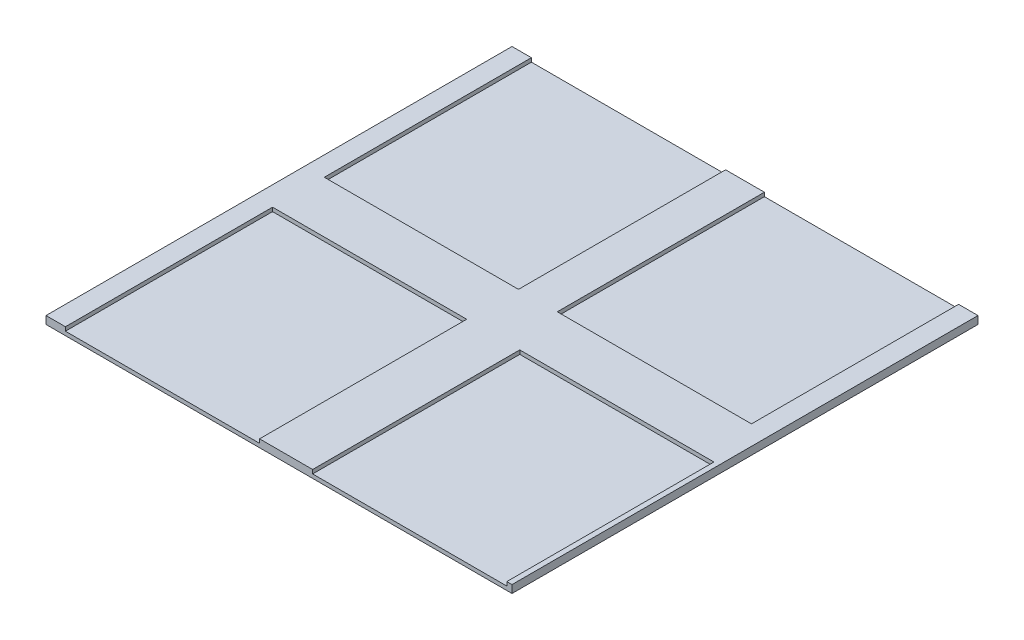
ISO-10303-21;
HEADER;
FILE_DESCRIPTION(('STEP AP214'),'2;1');
FILE_NAME('part.step','',(''),(''),'','','');
FILE_SCHEMA(('AUTOMOTIVE_DESIGN { 1 0 10303 214 1 1 1 1 }'));
ENDSEC;
DATA;
#1=APPLICATION_CONTEXT('core data for automotive mechanical design processes');
#2=APPLICATION_PROTOCOL_DEFINITION('international standard','automotive_design',2000,#1);
#3=PRODUCT_CONTEXT('',#1,'mechanical');
#4=PRODUCT('Part','Part','',(#3));
#5=PRODUCT_RELATED_PRODUCT_CATEGORY('part','',(#4));
#6=PRODUCT_DEFINITION_FORMATION('','',#4);
#7=PRODUCT_DEFINITION_CONTEXT('part definition',#1,'design');
#8=PRODUCT_DEFINITION('design','',#6,#7);
#9=PRODUCT_DEFINITION_SHAPE('','',#8);
#10=(LENGTH_UNIT() NAMED_UNIT(*) SI_UNIT(.MILLI.,.METRE.));
#11=(NAMED_UNIT(*) PLANE_ANGLE_UNIT() SI_UNIT($,.RADIAN.));
#12=(NAMED_UNIT(*) SI_UNIT($,.STERADIAN.) SOLID_ANGLE_UNIT());
#13=UNCERTAINTY_MEASURE_WITH_UNIT(LENGTH_MEASURE(1.E-05),#10,'distance_accuracy_value','');
#14=(GEOMETRIC_REPRESENTATION_CONTEXT(3) GLOBAL_UNCERTAINTY_ASSIGNED_CONTEXT((#13)) GLOBAL_UNIT_ASSIGNED_CONTEXT((#10,
#11,#12)) REPRESENTATION_CONTEXT('',''));
#15=CARTESIAN_POINT('',(0.,0.,0.));
#16=DIRECTION('',(0.,0.,1.));
#17=DIRECTION('',(1.,0.,0.));
#18=AXIS2_PLACEMENT_3D('',#15,#16,#17);
#19=CARTESIAN_POINT('',(160.,3.,20.));
#20=DIRECTION('',(0.,0.,-1.));
#21=DIRECTION('',(-1.,0.,0.));
#22=AXIS2_PLACEMENT_3D('',#19,#20,#21);
#23=PLANE('',#22);
#24=DIRECTION('',(0.,-1.,0.));
#25=VECTOR('',#24,1.);
#26=CARTESIAN_POINT('',(176.,166.04999218994,20.));
#27=LINE('',#26,#25);
#28=CARTESIAN_POINT('',(176.,6.00000000000001,20.));
#29=VERTEX_POINT('',#28);
#30=CARTESIAN_POINT('',(176.,3.,20.));
#31=VERTEX_POINT('',#30);
#32=EDGE_CURVE('E285',#29,#31,#27,.T.);
#33=ORIENTED_EDGE('',*,*,#32,.F.);
#34=DIRECTION('',(-1.,0.,0.));
#35=VECTOR('',#34,1.);
#36=CARTESIAN_POINT('',(160.,6.,20.));
#37=LINE('',#36,#35);
#38=CARTESIAN_POINT('',(26.,6.,20.));
#39=VERTEX_POINT('',#38);
#40=EDGE_CURVE('E198',#29,#39,#37,.T.);
#41=ORIENTED_EDGE('',*,*,#40,.T.);
#42=DIRECTION('',(0.,1.,0.));
#43=VECTOR('',#42,1.);
#44=CARTESIAN_POINT('',(26.,-220.436914860025,20.));
#45=LINE('',#44,#43);
#46=CARTESIAN_POINT('',(26.,3.,20.));
#47=VERTEX_POINT('',#46);
#48=EDGE_CURVE('E205',#47,#39,#45,.T.);
#49=ORIENTED_EDGE('',*,*,#48,.F.);
#50=DIRECTION('',(-1.,0.,0.));
#51=VECTOR('',#50,1.);
#52=CARTESIAN_POINT('',(160.,3.,20.));
#53=LINE('',#52,#51);
#54=EDGE_CURVE('E190',#31,#47,#53,.T.);
#55=ORIENTED_EDGE('',*,*,#54,.F.);
#56=EDGE_LOOP('',(#33,#41,#49,#55));
#57=FACE_BOUND('',#56,.T.);
#58=ADVANCED_FACE('F42',(#57),#23,.F.);
#59=CARTESIAN_POINT('',(0.,3.,0.));
#60=DIRECTION('',(0.,-1.,0.));
#61=DIRECTION('',(0.,0.,-1.));
#62=AXIS2_PLACEMENT_3D('',#59,#60,#61);
#63=PLANE('',#62);
#64=DIRECTION('',(0.,0.,1.));
#65=VECTOR('',#64,1.);
#66=CARTESIAN_POINT('',(176.,3.,20.));
#67=LINE('',#66,#65);
#68=CARTESIAN_POINT('',(176.,3.,180.));
#69=VERTEX_POINT('',#68);
#70=EDGE_CURVE('E58',#31,#69,#67,.T.);
#71=ORIENTED_EDGE('',*,*,#70,.F.);
#72=ORIENTED_EDGE('',*,*,#54,.T.);
#73=DIRECTION('',(0.,0.,1.));
#74=VECTOR('',#73,1.);
#75=CARTESIAN_POINT('',(26.,3.,20.));
#76=LINE('',#75,#74);
#77=CARTESIAN_POINT('',(26.,3.,180.));
#78=VERTEX_POINT('',#77);
#79=EDGE_CURVE('E194',#47,#78,#76,.T.);
#80=ORIENTED_EDGE('',*,*,#79,.T.);
#81=DIRECTION('',(-1.,0.,0.));
#82=VECTOR('',#81,1.);
#83=CARTESIAN_POINT('',(-180.,3.,180.));
#84=LINE('',#83,#82);
#85=EDGE_CURVE('E302',#69,#78,#84,.T.);
#86=ORIENTED_EDGE('',*,*,#85,.F.);
#87=EDGE_LOOP('',(#71,#72,#80,#86));
#88=FACE_BOUND('',#87,.T.);
#89=ADVANCED_FACE('F192',(#88),#63,.F.);
#90=CARTESIAN_POINT('',(-180.,6.,-180.));
#91=DIRECTION('',(0.,0.,1.));
#92=DIRECTION('',(1.,0.,0.));
#93=AXIS2_PLACEMENT_3D('',#90,#91,#92);
#94=PLANE('',#93);
#95=DIRECTION('',(1.,0.,0.));
#96=VECTOR('',#95,1.);
#97=CARTESIAN_POINT('',(-180.,3.,-180.));
#98=LINE('',#97,#96);
#99=CARTESIAN_POINT('',(-165.,3.,-180.));
#100=VERTEX_POINT('',#99);
#101=CARTESIAN_POINT('',(-15.,3.,-180.));
#102=VERTEX_POINT('',#101);
#103=EDGE_CURVE('E297',#100,#102,#98,.T.);
#104=ORIENTED_EDGE('',*,*,#103,.T.);
#105=DIRECTION('',(0.,1.,0.));
#106=VECTOR('',#105,1.);
#107=CARTESIAN_POINT('',(-15.,6.,-180.));
#108=LINE('',#107,#106);
#109=CARTESIAN_POINT('',(-15.,6.,-180.));
#110=VERTEX_POINT('',#109);
#111=EDGE_CURVE('E276',#102,#110,#108,.T.);
#112=ORIENTED_EDGE('',*,*,#111,.T.);
#113=DIRECTION('',(-1.,0.,0.));
#114=VECTOR('',#113,1.);
#115=CARTESIAN_POINT('',(-180.,6.,-180.));
#116=LINE('',#115,#114);
#117=CARTESIAN_POINT('',(15.,6.,-180.));
#118=VERTEX_POINT('',#117);
#119=EDGE_CURVE('E324',#118,#110,#116,.T.);
#120=ORIENTED_EDGE('',*,*,#119,.F.);
#121=DIRECTION('',(0.,-1.,0.));
#122=VECTOR('',#121,1.);
#123=CARTESIAN_POINT('',(15.,6.,-180.));
#124=LINE('',#123,#122);
#125=CARTESIAN_POINT('',(15.,3.,-180.));
#126=VERTEX_POINT('',#125);
#127=EDGE_CURVE('E233',#118,#126,#124,.T.);
#128=ORIENTED_EDGE('',*,*,#127,.T.);
#129=DIRECTION('',(1.,0.,0.));
#130=VECTOR('',#129,1.);
#131=CARTESIAN_POINT('',(-180.,3.,-180.));
#132=LINE('',#131,#130);
#133=CARTESIAN_POINT('',(165.,3.,-180.));
#134=VERTEX_POINT('',#133);
#135=EDGE_CURVE('E300',#126,#134,#132,.T.);
#136=ORIENTED_EDGE('',*,*,#135,.T.);
#137=DIRECTION('',(0.,1.,0.));
#138=VECTOR('',#137,1.);
#139=CARTESIAN_POINT('',(165.,6.,-180.));
#140=LINE('',#139,#138);
#141=CARTESIAN_POINT('',(165.,6.,-180.));
#142=VERTEX_POINT('',#141);
#143=EDGE_CURVE('E270',#134,#142,#140,.T.);
#144=ORIENTED_EDGE('',*,*,#143,.T.);
#145=CARTESIAN_POINT('',(180.,6.,-180.));
#146=VERTEX_POINT('',#145);
#147=EDGE_CURVE('E322',#146,#142,#116,.T.);
#148=ORIENTED_EDGE('',*,*,#147,.F.);
#149=DIRECTION('',(0.,-1.,0.));
#150=VECTOR('',#149,1.);
#151=CARTESIAN_POINT('',(180.,6.,-180.));
#152=LINE('',#151,#150);
#153=CARTESIAN_POINT('',(180.,0.,-180.));
#154=VERTEX_POINT('',#153);
#155=EDGE_CURVE('E46',#146,#154,#152,.T.);
#156=ORIENTED_EDGE('',*,*,#155,.T.);
#157=DIRECTION('',(-1.,0.,0.));
#158=VECTOR('',#157,1.);
#159=CARTESIAN_POINT('',(-180.,0.,-180.));
#160=LINE('',#159,#158);
#161=CARTESIAN_POINT('',(-180.,0.,-180.));
#162=VERTEX_POINT('',#161);
#163=EDGE_CURVE('E330',#154,#162,#160,.T.);
#164=ORIENTED_EDGE('',*,*,#163,.T.);
#165=DIRECTION('',(0.,-1.,0.));
#166=VECTOR('',#165,1.);
#167=CARTESIAN_POINT('',(-180.,6.,-180.));
#168=LINE('',#167,#166);
#169=CARTESIAN_POINT('',(-180.,6.,-180.));
#170=VERTEX_POINT('',#169);
#171=EDGE_CURVE('E338',#170,#162,#168,.T.);
#172=ORIENTED_EDGE('',*,*,#171,.F.);
#173=CARTESIAN_POINT('',(-165.,6.,-180.));
#174=VERTEX_POINT('',#173);
#175=EDGE_CURVE('E320',#174,#170,#116,.T.);
#176=ORIENTED_EDGE('',*,*,#175,.F.);
#177=DIRECTION('',(0.,-1.,0.));
#178=VECTOR('',#177,1.);
#179=CARTESIAN_POINT('',(-165.,6.,-180.));
#180=LINE('',#179,#178);
#181=EDGE_CURVE('E273',#174,#100,#180,.T.);
#182=ORIENTED_EDGE('',*,*,#181,.T.);
#183=EDGE_LOOP('',(#104,#112,#120,#128,#136,#144,#148,#156,#164,#172,#176,#182));
#184=FACE_BOUND('',#183,.T.);
#185=ADVANCED_FACE('F346',(#184),#94,.F.);
#186=CARTESIAN_POINT('',(-180.,6.,180.));
#187=DIRECTION('',(0.,0.,-1.));
#188=DIRECTION('',(-1.,0.,0.));
#189=AXIS2_PLACEMENT_3D('',#186,#187,#188);
#190=PLANE('',#189);
#191=ORIENTED_EDGE('',*,*,#85,.T.);
#192=DIRECTION('',(0.,1.,0.));
#193=VECTOR('',#192,1.);
#194=CARTESIAN_POINT('',(26.,6.,180.));
#195=LINE('',#194,#193);
#196=CARTESIAN_POINT('',(26.,6.,180.));
#197=VERTEX_POINT('',#196);
#198=EDGE_CURVE('E208',#78,#197,#195,.T.);
#199=ORIENTED_EDGE('',*,*,#198,.T.);
#200=DIRECTION('',(1.,0.,0.));
#201=VECTOR('',#200,1.);
#202=CARTESIAN_POINT('',(-180.,6.,180.));
#203=LINE('',#202,#201);
#204=CARTESIAN_POINT('',(-15.,6.,180.));
#205=VERTEX_POINT('',#204);
#206=EDGE_CURVE('E326',#205,#197,#203,.T.);
#207=ORIENTED_EDGE('',*,*,#206,.F.);
#208=DIRECTION('',(0.,-1.,0.));
#209=VECTOR('',#208,1.);
#210=CARTESIAN_POINT('',(-15.,6.,180.));
#211=LINE('',#210,#209);
#212=CARTESIAN_POINT('',(-15.,3.,180.));
#213=VERTEX_POINT('',#212);
#214=EDGE_CURVE('E279',#205,#213,#211,.T.);
#215=ORIENTED_EDGE('',*,*,#214,.T.);
#216=DIRECTION('',(-1.,0.,0.));
#217=VECTOR('',#216,1.);
#218=CARTESIAN_POINT('',(-180.,3.,180.));
#219=LINE('',#218,#217);
#220=CARTESIAN_POINT('',(-165.,3.,180.));
#221=VERTEX_POINT('',#220);
#222=EDGE_CURVE('E304',#213,#221,#219,.T.);
#223=ORIENTED_EDGE('',*,*,#222,.T.);
#224=DIRECTION('',(0.,1.,0.));
#225=VECTOR('',#224,1.);
#226=CARTESIAN_POINT('',(-165.,6.,180.));
#227=LINE('',#226,#225);
#228=CARTESIAN_POINT('',(-165.,6.,180.));
#229=VERTEX_POINT('',#228);
#230=EDGE_CURVE('E282',#221,#229,#227,.T.);
#231=ORIENTED_EDGE('',*,*,#230,.T.);
#232=CARTESIAN_POINT('',(-180.,6.,180.));
#233=VERTEX_POINT('',#232);
#234=EDGE_CURVE('E327',#233,#229,#203,.T.);
#235=ORIENTED_EDGE('',*,*,#234,.F.);
#236=DIRECTION('',(0.,-1.,0.));
#237=VECTOR('',#236,1.);
#238=CARTESIAN_POINT('',(-180.,6.,180.));
#239=LINE('',#238,#237);
#240=CARTESIAN_POINT('',(-180.,0.,180.));
#241=VERTEX_POINT('',#240);
#242=EDGE_CURVE('E336',#233,#241,#239,.T.);
#243=ORIENTED_EDGE('',*,*,#242,.T.);
#244=DIRECTION('',(1.,0.,0.));
#245=VECTOR('',#244,1.);
#246=CARTESIAN_POINT('',(-180.,0.,180.));
#247=LINE('',#246,#245);
#248=CARTESIAN_POINT('',(180.,0.,180.));
#249=VERTEX_POINT('',#248);
#250=EDGE_CURVE('E321',#241,#249,#247,.T.);
#251=ORIENTED_EDGE('',*,*,#250,.T.);
#252=DIRECTION('',(0.,-1.,0.));
#253=VECTOR('',#252,1.);
#254=CARTESIAN_POINT('',(180.,6.,180.));
#255=LINE('',#254,#253);
#256=CARTESIAN_POINT('',(180.,6.00000000000001,180.));
#257=VERTEX_POINT('',#256);
#258=EDGE_CURVE('E88',#257,#249,#255,.T.);
#259=ORIENTED_EDGE('',*,*,#258,.F.);
#260=DIRECTION('',(1.,0.,0.));
#261=VECTOR('',#260,1.);
#262=CARTESIAN_POINT('',(180.,6.00000000000001,180.));
#263=LINE('',#262,#261);
#264=CARTESIAN_POINT('',(176.,6.00000000000001,180.));
#265=VERTEX_POINT('',#264);
#266=EDGE_CURVE('E292',#265,#257,#263,.T.);
#267=ORIENTED_EDGE('',*,*,#266,.F.);
#268=DIRECTION('',(0.,-1.,0.));
#269=VECTOR('',#268,1.);
#270=CARTESIAN_POINT('',(176.,166.04999218994,180.));
#271=LINE('',#270,#269);
#272=EDGE_CURVE('E287',#265,#69,#271,.T.);
#273=ORIENTED_EDGE('',*,*,#272,.T.);
#274=EDGE_LOOP('',(#191,#199,#207,#215,#223,#231,#235,#243,#251,#259,#267,#273));
#275=FACE_BOUND('',#274,.T.);
#276=ADVANCED_FACE('F354',(#275),#190,.F.);
#277=CARTESIAN_POINT('',(0.,6.,0.));
#278=DIRECTION('',(0.,1.,0.));
#279=DIRECTION('',(0.,0.,1.));
#280=AXIS2_PLACEMENT_3D('',#277,#278,#279);
#281=PLANE('',#280);
#282=DIRECTION('',(0.,0.,1.));
#283=VECTOR('',#282,1.);
#284=CARTESIAN_POINT('',(26.,6.,20.));
#285=LINE('',#284,#283);
#286=EDGE_CURVE('E211',#39,#197,#285,.T.);
#287=ORIENTED_EDGE('',*,*,#286,.F.);
#288=ORIENTED_EDGE('',*,*,#40,.F.);
#289=DIRECTION('',(0.,0.,1.));
#290=VECTOR('',#289,1.);
#291=CARTESIAN_POINT('',(176.,6.00000000000001,20.));
#292=LINE('',#291,#290);
#293=EDGE_CURVE('E288',#29,#265,#292,.T.);
#294=ORIENTED_EDGE('',*,*,#293,.T.);
#295=ORIENTED_EDGE('',*,*,#266,.T.);
#296=DIRECTION('',(0.,0.,-1.));
#297=VECTOR('',#296,1.);
#298=CARTESIAN_POINT('',(180.,6.,-180.));
#299=LINE('',#298,#297);
#300=EDGE_CURVE('E93',#257,#146,#299,.T.);
#301=ORIENTED_EDGE('',*,*,#300,.T.);
#302=ORIENTED_EDGE('',*,*,#147,.T.);
#303=DIRECTION('',(0.,0.,-1.));
#304=VECTOR('',#303,1.);
#305=CARTESIAN_POINT('',(165.,6.,-170.));
#306=LINE('',#305,#304);
#307=CARTESIAN_POINT('',(165.,6.,-20.));
#308=VERTEX_POINT('',#307);
#309=EDGE_CURVE('E259',#308,#142,#306,.T.);
#310=ORIENTED_EDGE('',*,*,#309,.F.);
#311=DIRECTION('',(1.,0.,0.));
#312=VECTOR('',#311,1.);
#313=CARTESIAN_POINT('',(160.,6.,-20.));
#314=LINE('',#313,#312);
#315=CARTESIAN_POINT('',(15.,6.,-20.));
#316=VERTEX_POINT('',#315);
#317=EDGE_CURVE('E199',#316,#308,#314,.T.);
#318=ORIENTED_EDGE('',*,*,#317,.F.);
#319=DIRECTION('',(0.,0.,1.));
#320=VECTOR('',#319,1.);
#321=CARTESIAN_POINT('',(15.,6.,-170.));
#322=LINE('',#321,#320);
#323=EDGE_CURVE('E243',#118,#316,#322,.T.);
#324=ORIENTED_EDGE('',*,*,#323,.F.);
#325=ORIENTED_EDGE('',*,*,#119,.T.);
#326=DIRECTION('',(0.,0.,-1.));
#327=VECTOR('',#326,1.);
#328=CARTESIAN_POINT('',(-15.,6.,-170.));
#329=LINE('',#328,#327);
#330=CARTESIAN_POINT('',(-15.,6.,-20.));
#331=VERTEX_POINT('',#330);
#332=EDGE_CURVE('E223',#331,#110,#329,.T.);
#333=ORIENTED_EDGE('',*,*,#332,.F.);
#334=DIRECTION('',(1.,0.,0.));
#335=VECTOR('',#334,1.);
#336=CARTESIAN_POINT('',(-160.,6.,-20.));
#337=LINE('',#336,#335);
#338=CARTESIAN_POINT('',(-165.,6.,-20.));
#339=VERTEX_POINT('',#338);
#340=EDGE_CURVE('E312',#339,#331,#337,.T.);
#341=ORIENTED_EDGE('',*,*,#340,.F.);
#342=DIRECTION('',(0.,0.,1.));
#343=VECTOR('',#342,1.);
#344=CARTESIAN_POINT('',(-165.,6.,-170.));
#345=LINE('',#344,#343);
#346=EDGE_CURVE('E249',#174,#339,#345,.T.);
#347=ORIENTED_EDGE('',*,*,#346,.F.);
#348=ORIENTED_EDGE('',*,*,#175,.T.);
#349=DIRECTION('',(0.,0.,1.));
#350=VECTOR('',#349,1.);
#351=CARTESIAN_POINT('',(-180.,6.,-180.));
#352=LINE('',#351,#350);
#353=EDGE_CURVE('E67',#170,#233,#352,.T.);
#354=ORIENTED_EDGE('',*,*,#353,.T.);
#355=ORIENTED_EDGE('',*,*,#234,.T.);
#356=DIRECTION('',(0.,0.,1.));
#357=VECTOR('',#356,1.);
#358=CARTESIAN_POINT('',(-165.,6.,170.));
#359=LINE('',#358,#357);
#360=CARTESIAN_POINT('',(-165.,6.,20.));
#361=VERTEX_POINT('',#360);
#362=EDGE_CURVE('E221',#361,#229,#359,.T.);
#363=ORIENTED_EDGE('',*,*,#362,.F.);
#364=DIRECTION('',(-1.,0.,0.));
#365=VECTOR('',#364,1.);
#366=CARTESIAN_POINT('',(-160.,6.,20.));
#367=LINE('',#366,#365);
#368=CARTESIAN_POINT('',(-15.,6.,20.));
#369=VERTEX_POINT('',#368);
#370=EDGE_CURVE('E307',#369,#361,#367,.T.);
#371=ORIENTED_EDGE('',*,*,#370,.F.);
#372=DIRECTION('',(0.,0.,-1.));
#373=VECTOR('',#372,1.);
#374=CARTESIAN_POINT('',(-15.,6.,170.));
#375=LINE('',#374,#373);
#376=EDGE_CURVE('E217',#205,#369,#375,.T.);
#377=ORIENTED_EDGE('',*,*,#376,.F.);
#378=ORIENTED_EDGE('',*,*,#206,.T.);
#379=EDGE_LOOP('',(#287,#288,#294,#295,#301,#302,#310,#318,#324,#325,#333,#341,#347,#348,#354,
#355,#363,#371,#377,#378));
#380=FACE_BOUND('',#379,.T.);
#381=ADVANCED_FACE('F357',(#380),#281,.T.);
#382=CARTESIAN_POINT('',(180.,6.,-180.));
#383=DIRECTION('',(-1.,0.,0.));
#384=DIRECTION('',(0.,0.,1.));
#385=AXIS2_PLACEMENT_3D('',#382,#383,#384);
#386=PLANE('',#385);
#387=ORIENTED_EDGE('',*,*,#300,.F.);
#388=ORIENTED_EDGE('',*,*,#258,.T.);
#389=DIRECTION('',(0.,0.,-1.));
#390=VECTOR('',#389,1.);
#391=CARTESIAN_POINT('',(180.,0.,-180.));
#392=LINE('',#391,#390);
#393=EDGE_CURVE('E317',#249,#154,#392,.T.);
#394=ORIENTED_EDGE('',*,*,#393,.T.);
#395=ORIENTED_EDGE('',*,*,#155,.F.);
#396=EDGE_LOOP('',(#387,#388,#394,#395));
#397=FACE_BOUND('',#396,.T.);
#398=ADVANCED_FACE('F44',(#397),#386,.F.);
#399=CARTESIAN_POINT('',(-180.,6.,-180.));
#400=DIRECTION('',(1.,0.,0.));
#401=DIRECTION('',(0.,0.,-1.));
#402=AXIS2_PLACEMENT_3D('',#399,#400,#401);
#403=PLANE('',#402);
#404=DIRECTION('',(0.,0.,1.));
#405=VECTOR('',#404,1.);
#406=CARTESIAN_POINT('',(-180.,0.,-180.));
#407=LINE('',#406,#405);
#408=EDGE_CURVE('E332',#162,#241,#407,.T.);
#409=ORIENTED_EDGE('',*,*,#408,.T.);
#410=ORIENTED_EDGE('',*,*,#242,.F.);
#411=ORIENTED_EDGE('',*,*,#353,.F.);
#412=ORIENTED_EDGE('',*,*,#171,.T.);
#413=EDGE_LOOP('',(#409,#410,#411,#412));
#414=FACE_BOUND('',#413,.T.);
#415=ADVANCED_FACE('F351',(#414),#403,.F.);
#416=CARTESIAN_POINT('',(0.,0.,0.));
#417=DIRECTION('',(0.,1.,0.));
#418=DIRECTION('',(0.,0.,1.));
#419=AXIS2_PLACEMENT_3D('',#416,#417,#418);
#420=PLANE('',#419);
#421=CARTESIAN_POINT('',(0.,0.,0.));
#422=DIRECTION('',(0.,-1.,0.));
#423=DIRECTION('',(0.,0.,-1.));
#424=AXIS2_PLACEMENT_3D('',#421,#422,#423);
#425=CIRCLE('',#424,42.212172728135);
#426=CARTESIAN_POINT('',(0.,0.,-42.212172728135));
#427=VERTEX_POINT('',#426);
#428=EDGE_CURVE('E11',#427,#427,#425,.T.);
#429=ORIENTED_EDGE('',*,*,#428,.F.);
#430=EDGE_LOOP('',(#429));
#431=FACE_BOUND('',#430,.T.);
#432=ORIENTED_EDGE('',*,*,#393,.F.);
#433=ORIENTED_EDGE('',*,*,#250,.F.);
#434=ORIENTED_EDGE('',*,*,#408,.F.);
#435=ORIENTED_EDGE('',*,*,#163,.F.);
#436=EDGE_LOOP('',(#432,#433,#434,#435));
#437=FACE_BOUND('',#436,.T.);
#438=ADVANCED_FACE('F350',(#431,#437),#420,.F.);
#439=CARTESIAN_POINT('',(-160.,3.,20.));
#440=DIRECTION('',(0.,0.,-1.));
#441=DIRECTION('',(-1.,0.,0.));
#442=AXIS2_PLACEMENT_3D('',#439,#440,#441);
#443=PLANE('',#442);
#444=ORIENTED_EDGE('',*,*,#370,.T.);
#445=DIRECTION('',(0.,1.,0.));
#446=VECTOR('',#445,1.);
#447=CARTESIAN_POINT('',(-165.,-236.104457123936,20.));
#448=LINE('',#447,#446);
#449=CARTESIAN_POINT('',(-165.,3.,20.));
#450=VERTEX_POINT('',#449);
#451=EDGE_CURVE('E230',#450,#361,#448,.T.);
#452=ORIENTED_EDGE('',*,*,#451,.F.);
#453=DIRECTION('',(-1.,0.,0.));
#454=VECTOR('',#453,1.);
#455=CARTESIAN_POINT('',(-160.,3.,20.));
#456=LINE('',#455,#454);
#457=CARTESIAN_POINT('',(-15.,3.,20.));
#458=VERTEX_POINT('',#457);
#459=EDGE_CURVE('E315',#458,#450,#456,.T.);
#460=ORIENTED_EDGE('',*,*,#459,.F.);
#461=DIRECTION('',(0.,1.,0.));
#462=VECTOR('',#461,1.);
#463=CARTESIAN_POINT('',(-15.,-236.104457123936,20.));
#464=LINE('',#463,#462);
#465=EDGE_CURVE('E229',#458,#369,#464,.T.);
#466=ORIENTED_EDGE('',*,*,#465,.T.);
#467=EDGE_LOOP('',(#444,#452,#460,#466));
#468=FACE_BOUND('',#467,.T.);
#469=ADVANCED_FACE('F364',(#468),#443,.F.);
#470=CARTESIAN_POINT('',(0.,3.,0.));
#471=DIRECTION('',(0.,1.,0.));
#472=DIRECTION('',(0.,0.,1.));
#473=AXIS2_PLACEMENT_3D('',#470,#471,#472);
#474=PLANE('',#473);
#475=ORIENTED_EDGE('',*,*,#222,.F.);
#476=DIRECTION('',(0.,0.,-1.));
#477=VECTOR('',#476,1.);
#478=CARTESIAN_POINT('',(-15.,3.,170.));
#479=LINE('',#478,#477);
#480=EDGE_CURVE('E226',#213,#458,#479,.T.);
#481=ORIENTED_EDGE('',*,*,#480,.T.);
#482=ORIENTED_EDGE('',*,*,#459,.T.);
#483=DIRECTION('',(0.,0.,1.));
#484=VECTOR('',#483,1.);
#485=CARTESIAN_POINT('',(-165.,3.,170.));
#486=LINE('',#485,#484);
#487=EDGE_CURVE('E220',#450,#221,#486,.T.);
#488=ORIENTED_EDGE('',*,*,#487,.T.);
#489=EDGE_LOOP('',(#475,#481,#482,#488));
#490=FACE_BOUND('',#489,.T.);
#491=ADVANCED_FACE('F400',(#490),#474,.T.);
#492=CARTESIAN_POINT('',(160.,3.,-20.));
#493=DIRECTION('',(0.,0.,1.));
#494=DIRECTION('',(1.,0.,0.));
#495=AXIS2_PLACEMENT_3D('',#492,#493,#494);
#496=PLANE('',#495);
#497=ORIENTED_EDGE('',*,*,#317,.T.);
#498=DIRECTION('',(0.,1.,0.));
#499=VECTOR('',#498,1.);
#500=CARTESIAN_POINT('',(165.,-236.104457123936,-20.));
#501=LINE('',#500,#499);
#502=CARTESIAN_POINT('',(165.,2.99999999999995,-20.));
#503=VERTEX_POINT('',#502);
#504=EDGE_CURVE('E256',#503,#308,#501,.T.);
#505=ORIENTED_EDGE('',*,*,#504,.F.);
#506=DIRECTION('',(1.,0.,0.));
#507=VECTOR('',#506,1.);
#508=CARTESIAN_POINT('',(160.,3.,-20.));
#509=LINE('',#508,#507);
#510=CARTESIAN_POINT('',(15.,3.,-20.));
#511=VERTEX_POINT('',#510);
#512=EDGE_CURVE('E310',#511,#503,#509,.T.);
#513=ORIENTED_EDGE('',*,*,#512,.F.);
#514=DIRECTION('',(0.,1.,0.));
#515=VECTOR('',#514,1.);
#516=CARTESIAN_POINT('',(15.,-236.104457123936,-20.));
#517=LINE('',#516,#515);
#518=EDGE_CURVE('E216',#511,#316,#517,.T.);
#519=ORIENTED_EDGE('',*,*,#518,.T.);
#520=EDGE_LOOP('',(#497,#505,#513,#519));
#521=FACE_BOUND('',#520,.T.);
#522=ADVANCED_FACE('F396',(#521),#496,.F.);
#523=CARTESIAN_POINT('',(0.,3.,0.));
#524=DIRECTION('',(0.,1.,0.));
#525=DIRECTION('',(0.,0.,1.));
#526=AXIS2_PLACEMENT_3D('',#523,#524,#525);
#527=PLANE('',#526);
#528=ORIENTED_EDGE('',*,*,#512,.T.);
#529=DIRECTION('',(0.,0.,-1.));
#530=VECTOR('',#529,1.);
#531=CARTESIAN_POINT('',(165.,3.,-170.));
#532=LINE('',#531,#530);
#533=EDGE_CURVE('E260',#503,#134,#532,.T.);
#534=ORIENTED_EDGE('',*,*,#533,.T.);
#535=ORIENTED_EDGE('',*,*,#135,.F.);
#536=DIRECTION('',(0.,0.,1.));
#537=VECTOR('',#536,1.);
#538=CARTESIAN_POINT('',(15.,3.,-170.));
#539=LINE('',#538,#537);
#540=EDGE_CURVE('E255',#126,#511,#539,.T.);
#541=ORIENTED_EDGE('',*,*,#540,.T.);
#542=EDGE_LOOP('',(#528,#534,#535,#541));
#543=FACE_BOUND('',#542,.T.);
#544=ADVANCED_FACE('F399',(#543),#527,.T.);
#545=CARTESIAN_POINT('',(-160.,3.,-20.));
#546=DIRECTION('',(0.,0.,1.));
#547=DIRECTION('',(1.,0.,0.));
#548=AXIS2_PLACEMENT_3D('',#545,#546,#547);
#549=PLANE('',#548);
#550=ORIENTED_EDGE('',*,*,#340,.T.);
#551=DIRECTION('',(0.,1.,0.));
#552=VECTOR('',#551,1.);
#553=CARTESIAN_POINT('',(-15.,-236.104457123936,-20.));
#554=LINE('',#553,#552);
#555=CARTESIAN_POINT('',(-15.,3.,-20.));
#556=VERTEX_POINT('',#555);
#557=EDGE_CURVE('E240',#556,#331,#554,.T.);
#558=ORIENTED_EDGE('',*,*,#557,.F.);
#559=DIRECTION('',(1.,0.,0.));
#560=VECTOR('',#559,1.);
#561=CARTESIAN_POINT('',(-160.,3.,-20.));
#562=LINE('',#561,#560);
#563=CARTESIAN_POINT('',(-165.,3.,-20.));
#564=VERTEX_POINT('',#563);
#565=EDGE_CURVE('E306',#564,#556,#562,.T.);
#566=ORIENTED_EDGE('',*,*,#565,.F.);
#567=DIRECTION('',(0.,1.,0.));
#568=VECTOR('',#567,1.);
#569=CARTESIAN_POINT('',(-165.,-236.104457123936,-20.));
#570=LINE('',#569,#568);
#571=EDGE_CURVE('E236',#564,#339,#570,.T.);
#572=ORIENTED_EDGE('',*,*,#571,.T.);
#573=EDGE_LOOP('',(#550,#558,#566,#572));
#574=FACE_BOUND('',#573,.T.);
#575=ADVANCED_FACE('F404',(#574),#549,.F.);
#576=CARTESIAN_POINT('',(0.,3.,0.));
#577=DIRECTION('',(0.,-1.,0.));
#578=DIRECTION('',(0.,0.,-1.));
#579=AXIS2_PLACEMENT_3D('',#576,#577,#578);
#580=PLANE('',#579);
#581=ORIENTED_EDGE('',*,*,#103,.F.);
#582=DIRECTION('',(0.,0.,1.));
#583=VECTOR('',#582,1.);
#584=CARTESIAN_POINT('',(-165.,3.,-170.));
#585=LINE('',#584,#583);
#586=EDGE_CURVE('E239',#100,#564,#585,.T.);
#587=ORIENTED_EDGE('',*,*,#586,.T.);
#588=ORIENTED_EDGE('',*,*,#565,.T.);
#589=DIRECTION('',(0.,0.,-1.));
#590=VECTOR('',#589,1.);
#591=CARTESIAN_POINT('',(-15.,3.,-170.));
#592=LINE('',#591,#590);
#593=EDGE_CURVE('E246',#556,#102,#592,.T.);
#594=ORIENTED_EDGE('',*,*,#593,.T.);
#595=EDGE_LOOP('',(#581,#587,#588,#594));
#596=FACE_BOUND('',#595,.T.);
#597=ADVANCED_FACE('F408',(#596),#580,.F.);
#598=CARTESIAN_POINT('',(0.,-1.,0.));
#599=DIRECTION('',(0.,1.,0.));
#600=DIRECTION('',(0.,0.,1.));
#601=AXIS2_PLACEMENT_3D('',#598,#599,#600);
#602=CYLINDRICAL_SURFACE('',#601,42.212172728135);
#603=CARTESIAN_POINT('',(0.,-1.,0.));
#604=DIRECTION('',(0.,-1.,0.));
#605=DIRECTION('',(0.,0.,-1.));
#606=AXIS2_PLACEMENT_3D('',#603,#604,#605);
#607=CIRCLE('',#606,42.212172728135);
#608=CARTESIAN_POINT('',(0.,-1.,-42.212172728135));
#609=VERTEX_POINT('',#608);
#610=EDGE_CURVE('E291',#609,#609,#607,.T.);
#611=ORIENTED_EDGE('',*,*,#610,.F.);
#612=EDGE_LOOP('',(#611));
#613=FACE_BOUND('',#612,.T.);
#614=ORIENTED_EDGE('',*,*,#428,.T.);
#615=EDGE_LOOP('',(#614));
#616=FACE_BOUND('',#615,.T.);
#617=ADVANCED_FACE('F384',(#613,#616),#602,.T.);
#618=CARTESIAN_POINT('',(0.,-1.,0.));
#619=DIRECTION('',(0.,-1.,0.));
#620=DIRECTION('',(0.,0.,-1.));
#621=AXIS2_PLACEMENT_3D('',#618,#619,#620);
#622=PLANE('',#621);
#623=ORIENTED_EDGE('',*,*,#610,.T.);
#624=EDGE_LOOP('',(#623));
#625=FACE_BOUND('',#624,.T.);
#626=ADVANCED_FACE('F375',(#625),#622,.T.);
#627=CARTESIAN_POINT('',(176.,166.04999218994,20.));
#628=DIRECTION('',(1.,0.,0.));
#629=DIRECTION('',(0.,0.,-1.));
#630=AXIS2_PLACEMENT_3D('',#627,#628,#629);
#631=PLANE('',#630);
#632=ORIENTED_EDGE('',*,*,#293,.F.);
#633=ORIENTED_EDGE('',*,*,#32,.T.);
#634=ORIENTED_EDGE('',*,*,#70,.T.);
#635=ORIENTED_EDGE('',*,*,#272,.F.);
#636=EDGE_LOOP('',(#632,#633,#634,#635));
#637=FACE_BOUND('',#636,.T.);
#638=ADVANCED_FACE('F372',(#637),#631,.F.);
#639=CARTESIAN_POINT('',(-15.,-236.104457123936,-170.));
#640=DIRECTION('',(1.,0.,0.));
#641=DIRECTION('',(0.,0.,-1.));
#642=AXIS2_PLACEMENT_3D('',#639,#640,#641);
#643=PLANE('',#642);
#644=ORIENTED_EDGE('',*,*,#593,.F.);
#645=ORIENTED_EDGE('',*,*,#557,.T.);
#646=ORIENTED_EDGE('',*,*,#332,.T.);
#647=ORIENTED_EDGE('',*,*,#111,.F.);
#648=EDGE_LOOP('',(#644,#645,#646,#647));
#649=FACE_BOUND('',#648,.T.);
#650=ADVANCED_FACE('F374',(#649),#643,.F.);
#651=CARTESIAN_POINT('',(-165.,-236.104457123936,-170.));
#652=DIRECTION('',(-1.,0.,0.));
#653=DIRECTION('',(0.,0.,1.));
#654=AXIS2_PLACEMENT_3D('',#651,#652,#653);
#655=PLANE('',#654);
#656=ORIENTED_EDGE('',*,*,#346,.T.);
#657=ORIENTED_EDGE('',*,*,#571,.F.);
#658=ORIENTED_EDGE('',*,*,#586,.F.);
#659=ORIENTED_EDGE('',*,*,#181,.F.);
#660=EDGE_LOOP('',(#656,#657,#658,#659));
#661=FACE_BOUND('',#660,.T.);
#662=ADVANCED_FACE('F381',(#661),#655,.F.);
#663=CARTESIAN_POINT('',(15.,-236.104457123936,-170.));
#664=DIRECTION('',(-1.,0.,0.));
#665=DIRECTION('',(0.,0.,1.));
#666=AXIS2_PLACEMENT_3D('',#663,#664,#665);
#667=PLANE('',#666);
#668=ORIENTED_EDGE('',*,*,#323,.T.);
#669=ORIENTED_EDGE('',*,*,#518,.F.);
#670=ORIENTED_EDGE('',*,*,#540,.F.);
#671=ORIENTED_EDGE('',*,*,#127,.F.);
#672=EDGE_LOOP('',(#668,#669,#670,#671));
#673=FACE_BOUND('',#672,.T.);
#674=ADVANCED_FACE('F572',(#673),#667,.F.);
#675=CARTESIAN_POINT('',(165.,-236.104457123936,-170.));
#676=DIRECTION('',(1.,0.,0.));
#677=DIRECTION('',(0.,0.,-1.));
#678=AXIS2_PLACEMENT_3D('',#675,#676,#677);
#679=PLANE('',#678);
#680=ORIENTED_EDGE('',*,*,#533,.F.);
#681=ORIENTED_EDGE('',*,*,#504,.T.);
#682=ORIENTED_EDGE('',*,*,#309,.T.);
#683=ORIENTED_EDGE('',*,*,#143,.F.);
#684=EDGE_LOOP('',(#680,#681,#682,#683));
#685=FACE_BOUND('',#684,.T.);
#686=ADVANCED_FACE('F582',(#685),#679,.F.);
#687=CARTESIAN_POINT('',(-165.,-236.104457123936,170.));
#688=DIRECTION('',(-1.,0.,0.));
#689=DIRECTION('',(0.,0.,1.));
#690=AXIS2_PLACEMENT_3D('',#687,#688,#689);
#691=PLANE('',#690);
#692=ORIENTED_EDGE('',*,*,#487,.F.);
#693=ORIENTED_EDGE('',*,*,#451,.T.);
#694=ORIENTED_EDGE('',*,*,#362,.T.);
#695=ORIENTED_EDGE('',*,*,#230,.F.);
#696=EDGE_LOOP('',(#692,#693,#694,#695));
#697=FACE_BOUND('',#696,.T.);
#698=ADVANCED_FACE('F361',(#697),#691,.F.);
#699=CARTESIAN_POINT('',(-15.,-236.104457123936,170.));
#700=DIRECTION('',(1.,0.,0.));
#701=DIRECTION('',(0.,0.,-1.));
#702=AXIS2_PLACEMENT_3D('',#699,#700,#701);
#703=PLANE('',#702);
#704=ORIENTED_EDGE('',*,*,#376,.T.);
#705=ORIENTED_EDGE('',*,*,#465,.F.);
#706=ORIENTED_EDGE('',*,*,#480,.F.);
#707=ORIENTED_EDGE('',*,*,#214,.F.);
#708=EDGE_LOOP('',(#704,#705,#706,#707));
#709=FACE_BOUND('',#708,.T.);
#710=ADVANCED_FACE('F368',(#709),#703,.F.);
#711=CARTESIAN_POINT('',(26.,-220.436914860025,20.));
#712=DIRECTION('',(-1.,0.,0.));
#713=DIRECTION('',(0.,0.,1.));
#714=AXIS2_PLACEMENT_3D('',#711,#712,#713);
#715=PLANE('',#714);
#716=ORIENTED_EDGE('',*,*,#79,.F.);
#717=ORIENTED_EDGE('',*,*,#48,.T.);
#718=ORIENTED_EDGE('',*,*,#286,.T.);
#719=ORIENTED_EDGE('',*,*,#198,.F.);
#720=EDGE_LOOP('',(#716,#717,#718,#719));
#721=FACE_BOUND('',#720,.T.);
#722=ADVANCED_FACE('F204',(#721),#715,.F.);
#723=CLOSED_SHELL('',(#58,#89,#185,#276,#381,#398,#415,#438,#469,#491,#522,#544,#575,#597,#617,
#626,#638,#650,#662,#674,#686,#698,#710,#722));
#724=MANIFOLD_SOLID_BREP('B2',#723);
#725=ADVANCED_BREP_SHAPE_REPRESENTATION('',(#18,#724),#14);
#726=SHAPE_DEFINITION_REPRESENTATION(#9,#725);
ENDSEC;
END-ISO-10303-21;
